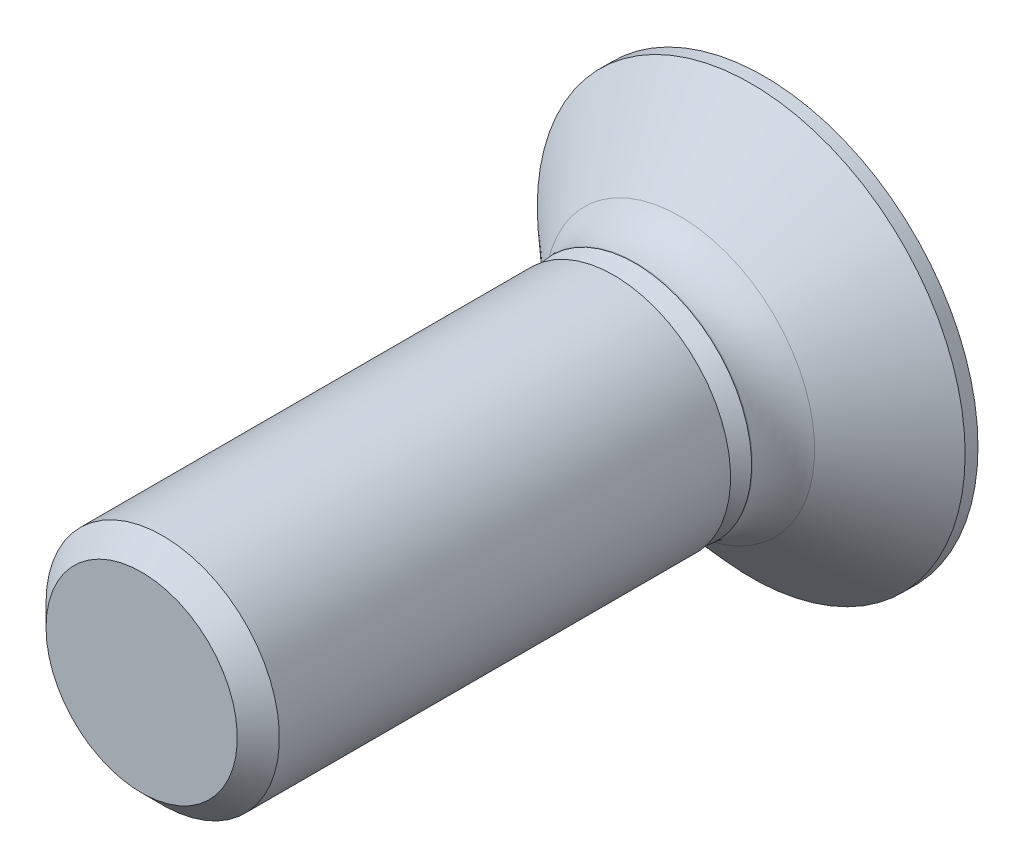
ISO-10303-21;
HEADER;
FILE_DESCRIPTION(('STEP AP214'),'2;1');
FILE_NAME('part.step','',(''),(''),'','','');
FILE_SCHEMA(('AUTOMOTIVE_DESIGN { 1 0 10303 214 1 1 1 1 }'));
ENDSEC;
DATA;
#1=APPLICATION_CONTEXT('core data for automotive mechanical design processes');
#2=APPLICATION_PROTOCOL_DEFINITION('international standard','automotive_design',2000,#1);
#3=PRODUCT_CONTEXT('',#1,'mechanical');
#4=PRODUCT('Part','Part','',(#3));
#5=PRODUCT_RELATED_PRODUCT_CATEGORY('part','',(#4));
#6=PRODUCT_DEFINITION_FORMATION('','',#4);
#7=PRODUCT_DEFINITION_CONTEXT('part definition',#1,'design');
#8=PRODUCT_DEFINITION('design','',#6,#7);
#9=PRODUCT_DEFINITION_SHAPE('','',#8);
#10=(LENGTH_UNIT() NAMED_UNIT(*) SI_UNIT(.MILLI.,.METRE.));
#11=(NAMED_UNIT(*) PLANE_ANGLE_UNIT() SI_UNIT($,.RADIAN.));
#12=(NAMED_UNIT(*) SI_UNIT($,.STERADIAN.) SOLID_ANGLE_UNIT());
#13=UNCERTAINTY_MEASURE_WITH_UNIT(LENGTH_MEASURE(1.E-05),#10,'distance_accuracy_value','');
#14=(GEOMETRIC_REPRESENTATION_CONTEXT(3) GLOBAL_UNCERTAINTY_ASSIGNED_CONTEXT((#13)) GLOBAL_UNIT_ASSIGNED_CONTEXT((#10,
#11,#12)) REPRESENTATION_CONTEXT('',''));
#15=CARTESIAN_POINT('',(0.,0.,0.));
#16=DIRECTION('',(0.,0.,1.));
#17=DIRECTION('',(1.,0.,0.));
#18=AXIS2_PLACEMENT_3D('',#15,#16,#17);
#19=CARTESIAN_POINT('',(0.,2.75,0.));
#20=DIRECTION('',(0.,0.,1.));
#21=DIRECTION('',(1.,0.,0.));
#22=AXIS2_PLACEMENT_3D('',#19,#20,#21);
#23=PLANE('',#22);
#24=CARTESIAN_POINT('',(0.,0.,0.));
#25=DIRECTION('',(0.,0.,-1.));
#26=DIRECTION('',(-1.,0.,0.));
#27=AXIS2_PLACEMENT_3D('',#24,#25,#26);
#28=CIRCLE('',#27,2.75);
#29=CARTESIAN_POINT('',(-2.75,0.,0.));
#30=VERTEX_POINT('',#29);
#31=EDGE_CURVE('E235',#30,#30,#28,.T.);
#32=ORIENTED_EDGE('',*,*,#31,.T.);
#33=EDGE_LOOP('',(#32));
#34=FACE_BOUND('',#33,.T.);
#35=DIRECTION('',(0.422618261740699,0.90630778703665,0.));
#36=VECTOR('',#35,1.);
#37=CARTESIAN_POINT('',(0.266666666666666,-1.6,0.));
#38=LINE('',#37,#36);
#39=CARTESIAN_POINT('',(0.266666666666666,-1.6,0.));
#40=VERTEX_POINT('',#39);
#41=CARTESIAN_POINT('',(0.690686510489199,-0.690686510489199,0.));
#42=VERTEX_POINT('',#41);
#43=EDGE_CURVE('E30',#40,#42,#38,.T.);
#44=ORIENTED_EDGE('',*,*,#43,.T.);
#45=DIRECTION('',(0.90630778703665,0.422618261740699,0.));
#46=VECTOR('',#45,1.);
#47=CARTESIAN_POINT('',(0.690686510489199,-0.690686510489199,0.));
#48=LINE('',#47,#46);
#49=CARTESIAN_POINT('',(1.6,-0.266666666666667,0.));
#50=VERTEX_POINT('',#49);
#51=EDGE_CURVE('E161',#42,#50,#48,.T.);
#52=ORIENTED_EDGE('',*,*,#51,.T.);
#53=DIRECTION('',(0.,1.,0.));
#54=VECTOR('',#53,1.);
#55=CARTESIAN_POINT('',(1.6,-0.266666666666667,0.));
#56=LINE('',#55,#54);
#57=CARTESIAN_POINT('',(1.6,0.266666666666666,0.));
#58=VERTEX_POINT('',#57);
#59=EDGE_CURVE('E157',#50,#58,#56,.T.);
#60=ORIENTED_EDGE('',*,*,#59,.T.);
#61=DIRECTION('',(-0.90630778703665,0.422618261740699,0.));
#62=VECTOR('',#61,1.);
#63=CARTESIAN_POINT('',(1.6,0.266666666666666,0.));
#64=LINE('',#63,#62);
#65=CARTESIAN_POINT('',(0.690686510489199,0.690686510489198,0.));
#66=VERTEX_POINT('',#65);
#67=EDGE_CURVE('E153',#58,#66,#64,.T.);
#68=ORIENTED_EDGE('',*,*,#67,.T.);
#69=DIRECTION('',(-0.422618261740699,0.90630778703665,0.));
#70=VECTOR('',#69,1.);
#71=CARTESIAN_POINT('',(0.690686510489199,0.690686510489198,0.));
#72=LINE('',#71,#70);
#73=CARTESIAN_POINT('',(0.266666666666667,1.6,0.));
#74=VERTEX_POINT('',#73);
#75=EDGE_CURVE('E149',#66,#74,#72,.T.);
#76=ORIENTED_EDGE('',*,*,#75,.T.);
#77=DIRECTION('',(-1.,0.,0.));
#78=VECTOR('',#77,1.);
#79=CARTESIAN_POINT('',(0.266666666666667,1.6,0.));
#80=LINE('',#79,#78);
#81=CARTESIAN_POINT('',(-0.266666666666666,1.6,0.));
#82=VERTEX_POINT('',#81);
#83=EDGE_CURVE('E145',#74,#82,#80,.T.);
#84=ORIENTED_EDGE('',*,*,#83,.T.);
#85=DIRECTION('',(-0.422618261740699,-0.90630778703665,0.));
#86=VECTOR('',#85,1.);
#87=CARTESIAN_POINT('',(-0.266666666666666,1.6,0.));
#88=LINE('',#87,#86);
#89=CARTESIAN_POINT('',(-0.690686510489197,0.690686510489199,0.));
#90=VERTEX_POINT('',#89);
#91=EDGE_CURVE('E141',#82,#90,#88,.T.);
#92=ORIENTED_EDGE('',*,*,#91,.T.);
#93=DIRECTION('',(-0.90630778703665,-0.422618261740699,0.));
#94=VECTOR('',#93,1.);
#95=CARTESIAN_POINT('',(-0.690686510489197,0.690686510489199,0.));
#96=LINE('',#95,#94);
#97=CARTESIAN_POINT('',(-1.6,0.266666666666667,0.));
#98=VERTEX_POINT('',#97);
#99=EDGE_CURVE('E137',#90,#98,#96,.T.);
#100=ORIENTED_EDGE('',*,*,#99,.T.);
#101=DIRECTION('',(0.,-1.,0.));
#102=VECTOR('',#101,1.);
#103=CARTESIAN_POINT('',(-1.6,0.266666666666667,0.));
#104=LINE('',#103,#102);
#105=CARTESIAN_POINT('',(-1.6,-0.266666666666666,0.));
#106=VERTEX_POINT('',#105);
#107=EDGE_CURVE('E132',#98,#106,#104,.T.);
#108=ORIENTED_EDGE('',*,*,#107,.T.);
#109=DIRECTION('',(0.90630778703665,-0.422618261740699,0.));
#110=VECTOR('',#109,1.);
#111=CARTESIAN_POINT('',(-1.6,-0.266666666666666,0.));
#112=LINE('',#111,#110);
#113=CARTESIAN_POINT('',(-0.690686510489199,-0.690686510489198,0.));
#114=VERTEX_POINT('',#113);
#115=EDGE_CURVE('E126',#106,#114,#112,.T.);
#116=ORIENTED_EDGE('',*,*,#115,.T.);
#117=DIRECTION('',(0.4226182617407,-0.90630778703665,0.));
#118=VECTOR('',#117,1.);
#119=CARTESIAN_POINT('',(-0.690686510489199,-0.690686510489198,0.));
#120=LINE('',#119,#118);
#121=CARTESIAN_POINT('',(-0.266666666666666,-1.6,0.));
#122=VERTEX_POINT('',#121);
#123=EDGE_CURVE('E109',#114,#122,#120,.T.);
#124=ORIENTED_EDGE('',*,*,#123,.T.);
#125=DIRECTION('',(1.,0.,0.));
#126=VECTOR('',#125,1.);
#127=CARTESIAN_POINT('',(-0.266666666666666,-1.6,0.));
#128=LINE('',#127,#126);
#129=EDGE_CURVE('E118',#122,#40,#128,.T.);
#130=ORIENTED_EDGE('',*,*,#129,.T.);
#131=EDGE_LOOP('',(#44,#52,#60,#68,#76,#84,#92,#100,#108,#116,#124,#130));
#132=FACE_BOUND('',#131,.T.);
#133=ADVANCED_FACE('F15',(#34,#132),#23,.F.);
#134=CARTESIAN_POINT('',(0.,0.,8.));
#135=DIRECTION('',(0.,0.,-1.));
#136=DIRECTION('',(-1.,0.,0.));
#137=AXIS2_PLACEMENT_3D('',#134,#135,#136);
#138=PLANE('',#137);
#139=CARTESIAN_POINT('',(0.,0.,8.));
#140=DIRECTION('',(0.,0.,-1.));
#141=DIRECTION('',(-1.,0.,0.));
#142=AXIS2_PLACEMENT_3D('',#139,#140,#141);
#143=CIRCLE('',#142,1.229375);
#144=CARTESIAN_POINT('',(-1.229375,0.,8.));
#145=VERTEX_POINT('',#144);
#146=EDGE_CURVE('E9',#145,#145,#143,.T.);
#147=ORIENTED_EDGE('',*,*,#146,.F.);
#148=EDGE_LOOP('',(#147));
#149=FACE_BOUND('',#148,.T.);
#150=ADVANCED_FACE('F274',(#149),#138,.F.);
#151=CARTESIAN_POINT('',(0.,0.,8.));
#152=DIRECTION('',(0.,0.,-1.));
#153=DIRECTION('',(-1.,0.,0.));
#154=AXIS2_PLACEMENT_3D('',#151,#152,#153);
#155=CONICAL_SURFACE('',#154,1.229375,0.785398163397449);
#156=CARTESIAN_POINT('',(0.,0.,7.729375));
#157=DIRECTION('',(0.,0.,-1.));
#158=DIRECTION('',(-1.,0.,0.));
#159=AXIS2_PLACEMENT_3D('',#156,#157,#158);
#160=CIRCLE('',#159,1.5);
#161=CARTESIAN_POINT('',(-1.5,0.,7.729375));
#162=VERTEX_POINT('',#161);
#163=EDGE_CURVE('E23',#162,#162,#160,.T.);
#164=ORIENTED_EDGE('',*,*,#163,.F.);
#165=EDGE_LOOP('',(#164));
#166=FACE_BOUND('',#165,.T.);
#167=ORIENTED_EDGE('',*,*,#146,.T.);
#168=EDGE_LOOP('',(#167));
#169=FACE_BOUND('',#168,.T.);
#170=ADVANCED_FACE('F271',(#166,#169),#155,.T.);
#171=CARTESIAN_POINT('',(0.,0.,0.));
#172=DIRECTION('',(0.,0.,-1.));
#173=DIRECTION('',(-1.,0.,0.));
#174=AXIS2_PLACEMENT_3D('',#171,#172,#173);
#175=CYLINDRICAL_SURFACE('',#174,1.5);
#176=CARTESIAN_POINT('',(0.,0.,1.930625));
#177=DIRECTION('',(0.,0.,-1.));
#178=DIRECTION('',(-1.,0.,0.));
#179=AXIS2_PLACEMENT_3D('',#176,#177,#178);
#180=CIRCLE('',#179,1.5);
#181=CARTESIAN_POINT('',(-1.5,0.,1.930625));
#182=VERTEX_POINT('',#181);
#183=EDGE_CURVE('E259',#182,#182,#180,.T.);
#184=ORIENTED_EDGE('',*,*,#183,.F.);
#185=EDGE_LOOP('',(#184));
#186=FACE_BOUND('',#185,.T.);
#187=ORIENTED_EDGE('',*,*,#163,.T.);
#188=EDGE_LOOP('',(#187));
#189=FACE_BOUND('',#188,.T.);
#190=ADVANCED_FACE('F269',(#186,#189),#175,.T.);
#191=CARTESIAN_POINT('',(0.,1.5,1.930625));
#192=DIRECTION('',(0.,0.,1.));
#193=DIRECTION('',(1.,0.,0.));
#194=AXIS2_PLACEMENT_3D('',#191,#192,#193);
#195=PLANE('',#194);
#196=CARTESIAN_POINT('',(0.,0.,1.930625));
#197=DIRECTION('',(0.,0.,-1.));
#198=DIRECTION('',(-1.,0.,0.));
#199=AXIS2_PLACEMENT_3D('',#196,#197,#198);
#200=CIRCLE('',#199,1.229375);
#201=CARTESIAN_POINT('',(-1.229375,0.,1.930625));
#202=VERTEX_POINT('',#201);
#203=EDGE_CURVE('E255',#202,#202,#200,.T.);
#204=ORIENTED_EDGE('',*,*,#203,.F.);
#205=EDGE_LOOP('',(#204));
#206=FACE_BOUND('',#205,.T.);
#207=ORIENTED_EDGE('',*,*,#183,.T.);
#208=EDGE_LOOP('',(#207));
#209=FACE_BOUND('',#208,.T.);
#210=ADVANCED_FACE('F287',(#206,#209),#195,.F.);
#211=CARTESIAN_POINT('',(0.,0.,1.930625));
#212=DIRECTION('',(0.,0.,-1.));
#213=DIRECTION('',(-1.,0.,0.));
#214=AXIS2_PLACEMENT_3D('',#211,#212,#213);
#215=CONICAL_SURFACE('',#214,1.229375,0.785398163397448);
#216=CARTESIAN_POINT('',(0.,0.,1.66));
#217=DIRECTION('',(0.,0.,-1.));
#218=DIRECTION('',(-1.,0.,0.));
#219=AXIS2_PLACEMENT_3D('',#216,#217,#218);
#220=CIRCLE('',#219,1.5);
#221=CARTESIAN_POINT('',(-1.5,0.,1.66));
#222=VERTEX_POINT('',#221);
#223=EDGE_CURVE('E251',#222,#222,#220,.T.);
#224=ORIENTED_EDGE('',*,*,#223,.F.);
#225=EDGE_LOOP('',(#224));
#226=FACE_BOUND('',#225,.T.);
#227=ORIENTED_EDGE('',*,*,#203,.T.);
#228=EDGE_LOOP('',(#227));
#229=FACE_BOUND('',#228,.T.);
#230=ADVANCED_FACE('F291',(#226,#229),#215,.T.);
#231=CARTESIAN_POINT('',(0.,0.,0.));
#232=DIRECTION('',(0.,0.,-1.));
#233=DIRECTION('',(-1.,0.,0.));
#234=AXIS2_PLACEMENT_3D('',#231,#232,#233);
#235=CYLINDRICAL_SURFACE('',#234,1.5);
#236=CARTESIAN_POINT('',(0.,0.,1.65));
#237=DIRECTION('',(0.,0.,-1.));
#238=DIRECTION('',(-1.,0.,0.));
#239=AXIS2_PLACEMENT_3D('',#236,#237,#238);
#240=CIRCLE('',#239,1.5);
#241=CARTESIAN_POINT('',(-1.5,0.,1.65));
#242=VERTEX_POINT('',#241);
#243=EDGE_CURVE('E247',#242,#242,#240,.T.);
#244=ORIENTED_EDGE('',*,*,#243,.F.);
#245=EDGE_LOOP('',(#244));
#246=FACE_BOUND('',#245,.T.);
#247=ORIENTED_EDGE('',*,*,#223,.T.);
#248=EDGE_LOOP('',(#247));
#249=FACE_BOUND('',#248,.T.);
#250=ADVANCED_FACE('F295',(#246,#249),#235,.T.);
#251=CARTESIAN_POINT('',(0.,0.,1.65));
#252=DIRECTION('',(0.,0.,-1.));
#253=DIRECTION('',(-1.,0.,0.));
#254=AXIS2_PLACEMENT_3D('',#251,#252,#253);
#255=TOROIDAL_SURFACE('',#254,2.3,0.8);
#256=ORIENTED_EDGE('',*,*,#243,.T.);
#257=EDGE_LOOP('',(#256));
#258=FACE_BOUND('',#257,.T.);
#259=CARTESIAN_POINT('',(0.,0.,1.08431457505076));
#260=DIRECTION('',(0.,0.,-1.));
#261=DIRECTION('',(-1.,0.,0.));
#262=AXIS2_PLACEMENT_3D('',#259,#260,#261);
#263=CIRCLE('',#262,1.73431457505076);
#264=CARTESIAN_POINT('',(-1.73431457505076,0.,1.08431457505076));
#265=VERTEX_POINT('',#264);
#266=EDGE_CURVE('E243',#265,#265,#263,.T.);
#267=ORIENTED_EDGE('',*,*,#266,.F.);
#268=EDGE_LOOP('',(#267));
#269=FACE_BOUND('',#268,.T.);
#270=ADVANCED_FACE('F299',(#258,#269),#255,.F.);
#271=CARTESIAN_POINT('',(0.,0.,1.08431457505076));
#272=DIRECTION('',(0.,0.,-1.));
#273=DIRECTION('',(-1.,0.,0.));
#274=AXIS2_PLACEMENT_3D('',#271,#272,#273);
#275=CONICAL_SURFACE('',#274,1.73431457505076,0.835161102643237);
#276=CARTESIAN_POINT('',(0.,0.,0.165));
#277=DIRECTION('',(0.,0.,-1.));
#278=DIRECTION('',(-1.,0.,0.));
#279=AXIS2_PLACEMENT_3D('',#276,#277,#278);
#280=CIRCLE('',#279,2.75);
#281=CARTESIAN_POINT('',(-2.75,0.,0.165));
#282=VERTEX_POINT('',#281);
#283=EDGE_CURVE('E239',#282,#282,#280,.T.);
#284=ORIENTED_EDGE('',*,*,#283,.F.);
#285=EDGE_LOOP('',(#284));
#286=FACE_BOUND('',#285,.T.);
#287=ORIENTED_EDGE('',*,*,#266,.T.);
#288=EDGE_LOOP('',(#287));
#289=FACE_BOUND('',#288,.T.);
#290=ADVANCED_FACE('F303',(#286,#289),#275,.T.);
#291=CARTESIAN_POINT('',(0.,0.,0.));
#292=DIRECTION('',(0.,0.,-1.));
#293=DIRECTION('',(-1.,0.,0.));
#294=AXIS2_PLACEMENT_3D('',#291,#292,#293);
#295=CYLINDRICAL_SURFACE('',#294,2.75);
#296=ORIENTED_EDGE('',*,*,#31,.F.);
#297=EDGE_LOOP('',(#296));
#298=FACE_BOUND('',#297,.T.);
#299=ORIENTED_EDGE('',*,*,#283,.T.);
#300=EDGE_LOOP('',(#299));
#301=FACE_BOUND('',#300,.T.);
#302=ADVANCED_FACE('F307',(#298,#301),#295,.T.);
#303=CARTESIAN_POINT('',(0.266666666666666,-1.6,0.));
#304=DIRECTION('',(-0.875426098065593,0.408217893676735,-0.258819045102521));
#305=DIRECTION('',(-0.422618261740699,-0.90630778703665,0.));
#306=AXIS2_PLACEMENT_3D('',#303,#304,#305);
#307=PLANE('',#306);
#308=DIRECTION('',(0.422618261740699,0.90630778703665,0.));
#309=VECTOR('',#308,1.);
#310=CARTESIAN_POINT('',(0.0311291837482248,-1.02727469648858,1.7));
#311=LINE('',#310,#309);
#312=CARTESIAN_POINT('',(0.,-1.09403144646646,1.7));
#313=VERTEX_POINT('',#312);
#314=CARTESIAN_POINT('',(0.347918282300735,-0.347918282300735,1.7));
#315=VERTEX_POINT('',#314);
#316=EDGE_CURVE('E122',#313,#315,#311,.T.);
#317=ORIENTED_EDGE('',*,*,#316,.T.);
#318=DIRECTION('',(0.193899607686987,-0.193899607686987,-0.961668281829896));
#319=VECTOR('',#318,1.);
#320=CARTESIAN_POINT('',(0.708932123765797,-0.708932123765797,-0.0904913000080147));
#321=LINE('',#320,#319);
#322=EDGE_CURVE('E196',#315,#42,#321,.T.);
#323=ORIENTED_EDGE('',*,*,#322,.T.);
#324=ORIENTED_EDGE('',*,*,#43,.F.);
#325=DIRECTION('',(0.162689201767992,-0.255370893567974,-0.953057149569945));
#326=VECTOR('',#325,1.);
#327=CARTESIAN_POINT('',(0.266666666666666,-1.6,0.));
#328=LINE('',#327,#326);
#329=CARTESIAN_POINT('',(0.,-1.18141717943534,1.56217235352282));
#330=VERTEX_POINT('',#329);
#331=EDGE_CURVE('E115',#330,#40,#328,.T.);
#332=ORIENTED_EDGE('',*,*,#331,.F.);
#333=DIRECTION('',(0.,-0.535467009821226,-0.844556144606808));
#334=VECTOR('',#333,1.);
#335=CARTESIAN_POINT('',(0.,-2.00789955953988,0.25861721431901));
#336=LINE('',#335,#334);
#337=EDGE_CURVE('E36',#313,#330,#336,.T.);
#338=ORIENTED_EDGE('',*,*,#337,.F.);
#339=EDGE_LOOP('',(#317,#323,#324,#332,#338));
#340=FACE_BOUND('',#339,.T.);
#341=ADVANCED_FACE('F311',(#340),#307,.T.);
#342=CARTESIAN_POINT('',(0.690686510489199,-0.690686510489199,0.));
#343=DIRECTION('',(-0.408217893676735,0.875426098065593,-0.258819045102521));
#344=DIRECTION('',(-0.90630778703665,-0.422618261740699,0.));
#345=AXIS2_PLACEMENT_3D('',#342,#343,#344);
#346=PLANE('',#345);
#347=DIRECTION('',(0.535467009821226,0.,-0.844556144606808));
#348=VECTOR('',#347,1.);
#349=CARTESIAN_POINT('',(2.00789955953988,0.,0.25861721431901));
#350=LINE('',#349,#348);
#351=CARTESIAN_POINT('',(1.09403144646646,0.,1.7));
#352=VERTEX_POINT('',#351);
#353=CARTESIAN_POINT('',(1.18141717943534,0.,1.56217235352282));
#354=VERTEX_POINT('',#353);
#355=EDGE_CURVE('E226',#352,#354,#350,.T.);
#356=ORIENTED_EDGE('',*,*,#355,.T.);
#357=DIRECTION('',(0.255370893567974,-0.162689201767992,-0.953057149569945));
#358=VECTOR('',#357,1.);
#359=CARTESIAN_POINT('',(1.6,-0.266666666666667,0.));
#360=LINE('',#359,#358);
#361=EDGE_CURVE('E193',#354,#50,#360,.T.);
#362=ORIENTED_EDGE('',*,*,#361,.T.);
#363=ORIENTED_EDGE('',*,*,#51,.F.);
#364=ORIENTED_EDGE('',*,*,#322,.F.);
#365=DIRECTION('',(0.90630778703665,0.422618261740699,0.));
#366=VECTOR('',#365,1.);
#367=CARTESIAN_POINT('',(0.0928666510036984,-0.466850811199468,1.7));
#368=LINE('',#367,#366);
#369=EDGE_CURVE('E201',#315,#352,#368,.T.);
#370=ORIENTED_EDGE('',*,*,#369,.T.);
#371=EDGE_LOOP('',(#356,#362,#363,#364,#370));
#372=FACE_BOUND('',#371,.T.);
#373=ADVANCED_FACE('F315',(#372),#346,.T.);
#374=CARTESIAN_POINT('',(1.6,-0.266666666666667,0.));
#375=DIRECTION('',(-0.965925826289068,0.,-0.258819045102521));
#376=DIRECTION('',(-0.258819045102521,0.,0.965925826289068));
#377=AXIS2_PLACEMENT_3D('',#374,#375,#376);
#378=PLANE('',#377);
#379=ORIENTED_EDGE('',*,*,#59,.F.);
#380=ORIENTED_EDGE('',*,*,#361,.F.);
#381=DIRECTION('',(0.255370893567974,0.162689201767992,-0.953057149569945));
#382=VECTOR('',#381,1.);
#383=CARTESIAN_POINT('',(1.6,0.266666666666666,0.));
#384=LINE('',#383,#382);
#385=EDGE_CURVE('E190',#354,#58,#384,.T.);
#386=ORIENTED_EDGE('',*,*,#385,.T.);
#387=EDGE_LOOP('',(#379,#380,#386));
#388=FACE_BOUND('',#387,.T.);
#389=ADVANCED_FACE('F318',(#388),#378,.T.);
#390=CARTESIAN_POINT('',(1.6,0.266666666666666,0.));
#391=DIRECTION('',(-0.408217893676735,-0.875426098065593,-0.258819045102521));
#392=DIRECTION('',(0.90630778703665,-0.422618261740699,0.));
#393=AXIS2_PLACEMENT_3D('',#390,#391,#392);
#394=PLANE('',#393);
#395=DIRECTION('',(-0.90630778703665,0.422618261740699,0.));
#396=VECTOR('',#395,1.);
#397=CARTESIAN_POINT('',(1.02727469648858,0.0311291837482241,1.7));
#398=LINE('',#397,#396);
#399=CARTESIAN_POINT('',(0.347918282300735,0.347918282300735,1.7));
#400=VERTEX_POINT('',#399);
#401=EDGE_CURVE('E205',#352,#400,#398,.T.);
#402=ORIENTED_EDGE('',*,*,#401,.T.);
#403=DIRECTION('',(0.193899607686987,0.193899607686987,-0.961668281829896));
#404=VECTOR('',#403,1.);
#405=CARTESIAN_POINT('',(0.708932123765798,0.708932123765797,-0.0904913000080147));
#406=LINE('',#405,#404);
#407=EDGE_CURVE('E187',#400,#66,#406,.T.);
#408=ORIENTED_EDGE('',*,*,#407,.T.);
#409=ORIENTED_EDGE('',*,*,#67,.F.);
#410=ORIENTED_EDGE('',*,*,#385,.F.);
#411=ORIENTED_EDGE('',*,*,#355,.F.);
#412=EDGE_LOOP('',(#402,#408,#409,#410,#411));
#413=FACE_BOUND('',#412,.T.);
#414=ADVANCED_FACE('F322',(#413),#394,.T.);
#415=CARTESIAN_POINT('',(0.690686510489199,0.690686510489198,0.));
#416=DIRECTION('',(-0.875426098065593,-0.408217893676735,-0.258819045102521));
#417=DIRECTION('',(0.422618261740699,-0.90630778703665,0.));
#418=AXIS2_PLACEMENT_3D('',#415,#416,#417);
#419=PLANE('',#418);
#420=DIRECTION('',(0.,0.535467009821226,-0.844556144606808));
#421=VECTOR('',#420,1.);
#422=CARTESIAN_POINT('',(0.,2.00789955953988,0.25861721431901));
#423=LINE('',#422,#421);
#424=CARTESIAN_POINT('',(0.,1.09403144646646,1.7));
#425=VERTEX_POINT('',#424);
#426=CARTESIAN_POINT('',(0.,1.18141717943534,1.56217235352282));
#427=VERTEX_POINT('',#426);
#428=EDGE_CURVE('E229',#425,#427,#423,.T.);
#429=ORIENTED_EDGE('',*,*,#428,.T.);
#430=DIRECTION('',(0.162689201767992,0.255370893567974,-0.953057149569945));
#431=VECTOR('',#430,1.);
#432=CARTESIAN_POINT('',(0.266666666666667,1.6,0.));
#433=LINE('',#432,#431);
#434=EDGE_CURVE('E184',#427,#74,#433,.T.);
#435=ORIENTED_EDGE('',*,*,#434,.T.);
#436=ORIENTED_EDGE('',*,*,#75,.F.);
#437=ORIENTED_EDGE('',*,*,#407,.F.);
#438=DIRECTION('',(-0.422618261740699,0.90630778703665,0.));
#439=VECTOR('',#438,1.);
#440=CARTESIAN_POINT('',(0.965537229233103,-0.976569823633555,1.7));
#441=LINE('',#440,#439);
#442=EDGE_CURVE('E208',#400,#425,#441,.T.);
#443=ORIENTED_EDGE('',*,*,#442,.T.);
#444=EDGE_LOOP('',(#429,#435,#436,#437,#443));
#445=FACE_BOUND('',#444,.T.);
#446=ADVANCED_FACE('F326',(#445),#419,.T.);
#447=CARTESIAN_POINT('',(0.266666666666667,1.6,0.));
#448=DIRECTION('',(0.,-0.965925826289068,-0.258819045102521));
#449=DIRECTION('',(0.,0.258819045102521,-0.965925826289068));
#450=AXIS2_PLACEMENT_3D('',#447,#448,#449);
#451=PLANE('',#450);
#452=ORIENTED_EDGE('',*,*,#83,.F.);
#453=ORIENTED_EDGE('',*,*,#434,.F.);
#454=DIRECTION('',(-0.162689201767992,0.255370893567974,-0.953057149569945));
#455=VECTOR('',#454,1.);
#456=CARTESIAN_POINT('',(-0.266666666666666,1.6,0.));
#457=LINE('',#456,#455);
#458=EDGE_CURVE('E181',#427,#82,#457,.T.);
#459=ORIENTED_EDGE('',*,*,#458,.T.);
#460=EDGE_LOOP('',(#452,#453,#459));
#461=FACE_BOUND('',#460,.T.);
#462=ADVANCED_FACE('F330',(#461),#451,.T.);
#463=CARTESIAN_POINT('',(-0.266666666666666,1.6,0.));
#464=DIRECTION('',(0.875426098065593,-0.408217893676735,-0.258819045102521));
#465=DIRECTION('',(0.422618261740699,0.90630778703665,0.));
#466=AXIS2_PLACEMENT_3D('',#463,#464,#465);
#467=PLANE('',#466);
#468=DIRECTION('',(-0.422618261740699,-0.90630778703665,0.));
#469=VECTOR('',#468,1.);
#470=CARTESIAN_POINT('',(-0.806947526414821,-0.636473108418201,1.7));
#471=LINE('',#470,#469);
#472=CARTESIAN_POINT('',(-0.347918282300733,0.347918282300735,1.7));
#473=VERTEX_POINT('',#472);
#474=EDGE_CURVE('E212',#425,#473,#471,.T.);
#475=ORIENTED_EDGE('',*,*,#474,.T.);
#476=DIRECTION('',(-0.193899607686987,0.193899607686987,-0.961668281829896));
#477=VECTOR('',#476,1.);
#478=CARTESIAN_POINT('',(-0.708932123765796,0.708932123765798,-0.0904913000080149));
#479=LINE('',#478,#477);
#480=EDGE_CURVE('E178',#473,#90,#479,.T.);
#481=ORIENTED_EDGE('',*,*,#480,.T.);
#482=ORIENTED_EDGE('',*,*,#91,.F.);
#483=ORIENTED_EDGE('',*,*,#458,.F.);
#484=ORIENTED_EDGE('',*,*,#428,.F.);
#485=EDGE_LOOP('',(#475,#481,#482,#483,#484));
#486=FACE_BOUND('',#485,.T.);
#487=ADVANCED_FACE('F334',(#486),#467,.T.);
#488=CARTESIAN_POINT('',(-0.690686510489197,0.690686510489199,0.));
#489=DIRECTION('',(0.408217893676735,-0.875426098065593,-0.258819045102521));
#490=DIRECTION('',(0.90630778703665,0.422618261740699,0.));
#491=AXIS2_PLACEMENT_3D('',#488,#489,#490);
#492=PLANE('',#491);
#493=DIRECTION('',(-0.535467009821226,0.,-0.844556144606808));
#494=VECTOR('',#493,1.);
#495=CARTESIAN_POINT('',(-2.00789955953988,0.,0.25861721431901));
#496=LINE('',#495,#494);
#497=CARTESIAN_POINT('',(-1.09403144646646,0.,1.7));
#498=VERTEX_POINT('',#497);
#499=CARTESIAN_POINT('',(-1.18141717943534,0.,1.56217235352282));
#500=VERTEX_POINT('',#499);
#501=EDGE_CURVE('E232',#498,#500,#496,.T.);
#502=ORIENTED_EDGE('',*,*,#501,.T.);
#503=DIRECTION('',(-0.255370893567974,0.162689201767992,-0.953057149569945));
#504=VECTOR('',#503,1.);
#505=CARTESIAN_POINT('',(-1.6,0.266666666666667,0.));
#506=LINE('',#505,#504);
#507=EDGE_CURVE('E175',#500,#98,#506,.T.);
#508=ORIENTED_EDGE('',*,*,#507,.T.);
#509=ORIENTED_EDGE('',*,*,#99,.F.);
#510=ORIENTED_EDGE('',*,*,#480,.F.);
#511=DIRECTION('',(-0.90630778703665,-0.422618261740699,0.));
#512=VECTOR('',#511,1.);
#513=CARTESIAN_POINT('',(-0.297934937066678,0.37122589896358,1.7));
#514=LINE('',#513,#512);
#515=EDGE_CURVE('E215',#473,#498,#514,.T.);
#516=ORIENTED_EDGE('',*,*,#515,.T.);
#517=EDGE_LOOP('',(#502,#508,#509,#510,#516));
#518=FACE_BOUND('',#517,.T.);
#519=ADVANCED_FACE('F338',(#518),#492,.T.);
#520=CARTESIAN_POINT('',(-1.6,0.266666666666667,0.));
#521=DIRECTION('',(0.965925826289068,0.,-0.258819045102521));
#522=DIRECTION('',(-0.258819045102521,0.,-0.965925826289068));
#523=AXIS2_PLACEMENT_3D('',#520,#521,#522);
#524=PLANE('',#523);
#525=ORIENTED_EDGE('',*,*,#107,.F.);
#526=ORIENTED_EDGE('',*,*,#507,.F.);
#527=DIRECTION('',(-0.255370893567974,-0.162689201767992,-0.953057149569945));
#528=VECTOR('',#527,1.);
#529=CARTESIAN_POINT('',(-1.6,-0.266666666666666,0.));
#530=LINE('',#529,#528);
#531=EDGE_CURVE('E172',#500,#106,#530,.T.);
#532=ORIENTED_EDGE('',*,*,#531,.T.);
#533=EDGE_LOOP('',(#525,#526,#532));
#534=FACE_BOUND('',#533,.T.);
#535=ADVANCED_FACE('F342',(#534),#524,.T.);
#536=CARTESIAN_POINT('',(-1.6,-0.266666666666666,0.));
#537=DIRECTION('',(0.408217893676735,0.875426098065593,-0.258819045102521));
#538=DIRECTION('',(-0.90630778703665,0.422618261740699,0.));
#539=AXIS2_PLACEMENT_3D('',#536,#537,#538);
#540=PLANE('',#539);
#541=DIRECTION('',(0.90630778703665,-0.422618261740699,0.));
#542=VECTOR('',#541,1.);
#543=CARTESIAN_POINT('',(0.6364731084182,-0.806947526414823,1.7));
#544=LINE('',#543,#542);
#545=CARTESIAN_POINT('',(-0.347918282300735,-0.347918282300734,1.7));
#546=VERTEX_POINT('',#545);
#547=EDGE_CURVE('E219',#498,#546,#544,.T.);
#548=ORIENTED_EDGE('',*,*,#547,.T.);
#549=DIRECTION('',(-0.193899607686987,-0.193899607686987,-0.961668281829896));
#550=VECTOR('',#549,1.);
#551=CARTESIAN_POINT('',(-0.708932123765798,-0.708932123765797,-0.0904913000080147));
#552=LINE('',#551,#550);
#553=EDGE_CURVE('E114',#546,#114,#552,.T.);
#554=ORIENTED_EDGE('',*,*,#553,.T.);
#555=ORIENTED_EDGE('',*,*,#115,.F.);
#556=ORIENTED_EDGE('',*,*,#531,.F.);
#557=ORIENTED_EDGE('',*,*,#501,.F.);
#558=EDGE_LOOP('',(#548,#554,#555,#556,#557));
#559=FACE_BOUND('',#558,.T.);
#560=ADVANCED_FACE('F346',(#559),#540,.T.);
#561=CARTESIAN_POINT('',(-0.690686510489199,-0.690686510489198,0.));
#562=DIRECTION('',(0.875426098065593,0.408217893676735,-0.258819045102521));
#563=DIRECTION('',(-0.422618261740699,0.90630778703665,0.));
#564=AXIS2_PLACEMENT_3D('',#561,#562,#563);
#565=PLANE('',#564);
#566=ORIENTED_EDGE('',*,*,#337,.T.);
#567=DIRECTION('',(-0.162689201767992,-0.255370893567974,-0.953057149569945));
#568=VECTOR('',#567,1.);
#569=CARTESIAN_POINT('',(-0.266666666666666,-1.6,0.));
#570=LINE('',#569,#568);
#571=EDGE_CURVE('E104',#330,#122,#570,.T.);
#572=ORIENTED_EDGE('',*,*,#571,.T.);
#573=ORIENTED_EDGE('',*,*,#123,.F.);
#574=ORIENTED_EDGE('',*,*,#553,.F.);
#575=DIRECTION('',(0.422618261740699,-0.90630778703665,0.));
#576=VECTOR('',#575,1.);
#577=CARTESIAN_POINT('',(0.127460519070055,-1.36737141170393,1.7));
#578=LINE('',#577,#576);
#579=EDGE_CURVE('E168',#546,#313,#578,.T.);
#580=ORIENTED_EDGE('',*,*,#579,.T.);
#581=EDGE_LOOP('',(#566,#572,#573,#574,#580));
#582=FACE_BOUND('',#581,.T.);
#583=ADVANCED_FACE('F106',(#582),#565,.T.);
#584=CARTESIAN_POINT('',(-0.266666666666666,-1.6,0.));
#585=DIRECTION('',(0.,0.965925826289068,-0.258819045102521));
#586=DIRECTION('',(0.,0.258819045102521,0.965925826289068));
#587=AXIS2_PLACEMENT_3D('',#584,#585,#586);
#588=PLANE('',#587);
#589=ORIENTED_EDGE('',*,*,#129,.F.);
#590=ORIENTED_EDGE('',*,*,#571,.F.);
#591=ORIENTED_EDGE('',*,*,#331,.T.);
#592=EDGE_LOOP('',(#589,#590,#591));
#593=FACE_BOUND('',#592,.T.);
#594=ADVANCED_FACE('F119',(#593),#588,.T.);
#595=CARTESIAN_POINT('',(0.443964731120089,-1.21978307378669,1.7));
#596=DIRECTION('',(0.,0.,-1.));
#597=DIRECTION('',(-1.,0.,0.));
#598=AXIS2_PLACEMENT_3D('',#595,#596,#597);
#599=PLANE('',#598);
#600=ORIENTED_EDGE('',*,*,#579,.F.);
#601=ORIENTED_EDGE('',*,*,#547,.F.);
#602=ORIENTED_EDGE('',*,*,#515,.F.);
#603=ORIENTED_EDGE('',*,*,#474,.F.);
#604=ORIENTED_EDGE('',*,*,#442,.F.);
#605=ORIENTED_EDGE('',*,*,#401,.F.);
#606=ORIENTED_EDGE('',*,*,#369,.F.);
#607=ORIENTED_EDGE('',*,*,#316,.F.);
#608=EDGE_LOOP('',(#600,#601,#602,#603,#604,#605,#606,#607));
#609=FACE_BOUND('',#608,.T.);
#610=ADVANCED_FACE('F355',(#609),#599,.T.);
#611=CLOSED_SHELL('',(#133,#150,#170,#190,#210,#230,#250,#270,#290,#302,#341,#373,#389,#414,
#446,#462,#487,#519,#535,#560,#583,#594,#610));
#612=MANIFOLD_SOLID_BREP('B1',#611);
#613=ADVANCED_BREP_SHAPE_REPRESENTATION('',(#18,#612),#14);
#614=SHAPE_DEFINITION_REPRESENTATION(#9,#613);
ENDSEC;
END-ISO-10303-21;
